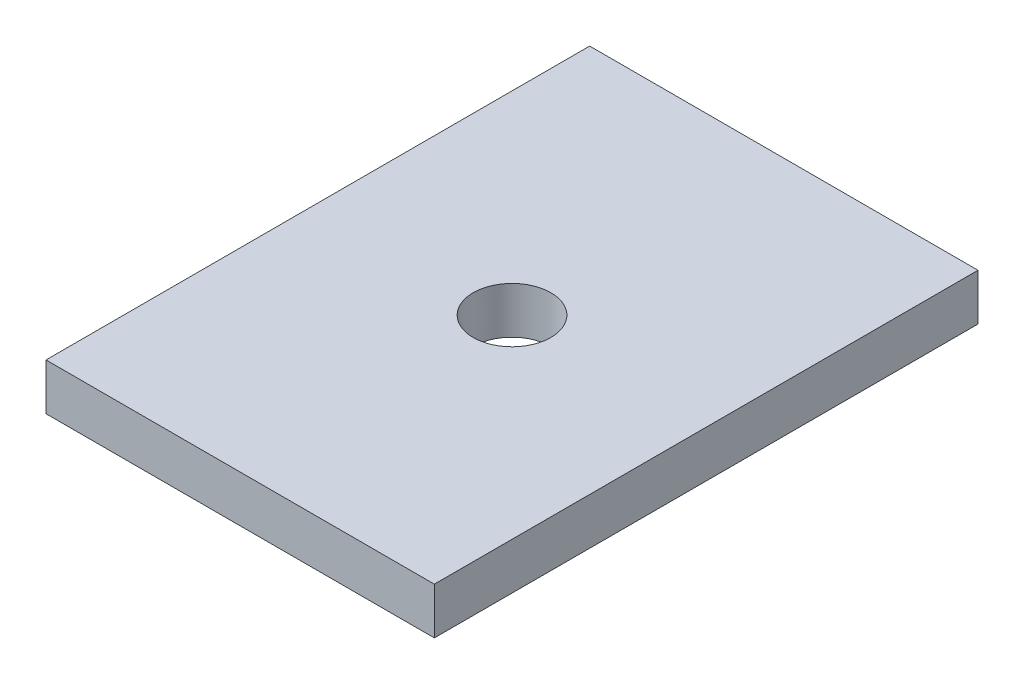
ISO-10303-21;
HEADER;
FILE_DESCRIPTION(('STEP AP214'),'2;1');
FILE_NAME('part.step','',(''),(''),'','','');
FILE_SCHEMA(('AUTOMOTIVE_DESIGN { 1 0 10303 214 1 1 1 1 }'));
ENDSEC;
DATA;
#1=APPLICATION_CONTEXT('core data for automotive mechanical design processes');
#2=APPLICATION_PROTOCOL_DEFINITION('international standard','automotive_design',2000,#1);
#3=PRODUCT_CONTEXT('',#1,'mechanical');
#4=PRODUCT('Part','Part','',(#3));
#5=PRODUCT_RELATED_PRODUCT_CATEGORY('part','',(#4));
#6=PRODUCT_DEFINITION_FORMATION('','',#4);
#7=PRODUCT_DEFINITION_CONTEXT('part definition',#1,'design');
#8=PRODUCT_DEFINITION('design','',#6,#7);
#9=PRODUCT_DEFINITION_SHAPE('','',#8);
#10=(LENGTH_UNIT() NAMED_UNIT(*) SI_UNIT(.MILLI.,.METRE.));
#11=(NAMED_UNIT(*) PLANE_ANGLE_UNIT() SI_UNIT($,.RADIAN.));
#12=(NAMED_UNIT(*) SI_UNIT($,.STERADIAN.) SOLID_ANGLE_UNIT());
#13=UNCERTAINTY_MEASURE_WITH_UNIT(LENGTH_MEASURE(1.E-05),#10,'distance_accuracy_value','');
#14=(GEOMETRIC_REPRESENTATION_CONTEXT(3) GLOBAL_UNCERTAINTY_ASSIGNED_CONTEXT((#13)) GLOBAL_UNIT_ASSIGNED_CONTEXT((#10,
#11,#12)) REPRESENTATION_CONTEXT('',''));
#15=CARTESIAN_POINT('',(0.,0.,0.));
#16=DIRECTION('',(0.,0.,1.));
#17=DIRECTION('',(1.,0.,0.));
#18=AXIS2_PLACEMENT_3D('',#15,#16,#17);
#19=CARTESIAN_POINT('',(0.,3.,0.));
#20=DIRECTION('',(0.,-1.,0.));
#21=DIRECTION('',(0.,0.,-1.));
#22=AXIS2_PLACEMENT_3D('',#19,#20,#21);
#23=PLANE('',#22);
#24=DIRECTION('',(0.,0.,1.));
#25=VECTOR('',#24,1.);
#26=CARTESIAN_POINT('',(0.,3.,0.));
#27=LINE('',#26,#25);
#28=CARTESIAN_POINT('',(0.,3.,-35.));
#29=VERTEX_POINT('',#28);
#30=CARTESIAN_POINT('',(0.,3.,0.));
#31=VERTEX_POINT('',#30);
#32=EDGE_CURVE('E85',#29,#31,#27,.T.);
#33=ORIENTED_EDGE('',*,*,#32,.T.);
#34=DIRECTION('',(1.,0.,0.));
#35=VECTOR('',#34,1.);
#36=CARTESIAN_POINT('',(0.,3.,0.));
#37=LINE('',#36,#35);
#38=CARTESIAN_POINT('',(25.,3.,0.));
#39=VERTEX_POINT('',#38);
#40=EDGE_CURVE('E80',#31,#39,#37,.T.);
#41=ORIENTED_EDGE('',*,*,#40,.T.);
#42=DIRECTION('',(0.,0.,-1.));
#43=VECTOR('',#42,1.);
#44=CARTESIAN_POINT('',(25.,3.,0.));
#45=LINE('',#44,#43);
#46=CARTESIAN_POINT('',(25.,3.,-35.));
#47=VERTEX_POINT('',#46);
#48=EDGE_CURVE('E83',#39,#47,#45,.T.);
#49=ORIENTED_EDGE('',*,*,#48,.T.);
#50=DIRECTION('',(-1.,0.,0.));
#51=VECTOR('',#50,1.);
#52=CARTESIAN_POINT('',(0.,3.,-35.));
#53=LINE('',#52,#51);
#54=EDGE_CURVE('E50',#47,#29,#53,.T.);
#55=ORIENTED_EDGE('',*,*,#54,.T.);
#56=EDGE_LOOP('',(#33,#41,#49,#55));
#57=FACE_BOUND('',#56,.T.);
#58=CARTESIAN_POINT('',(12.5,3.,-17.5));
#59=DIRECTION('',(0.,-1.,0.));
#60=DIRECTION('',(0.,0.,-1.));
#61=AXIS2_PLACEMENT_3D('',#58,#59,#60);
#62=CIRCLE('',#61,2.5);
#63=CARTESIAN_POINT('',(12.5,3.,-20.));
#64=VERTEX_POINT('',#63);
#65=EDGE_CURVE('E100',#64,#64,#62,.F.);
#66=ORIENTED_EDGE('',*,*,#65,.F.);
#67=EDGE_LOOP('',(#66));
#68=FACE_BOUND('',#67,.T.);
#69=ADVANCED_FACE('F33',(#57,#68),#23,.F.);
#70=CARTESIAN_POINT('',(0.,0.,0.));
#71=DIRECTION('',(0.,-1.,0.));
#72=DIRECTION('',(0.,0.,-1.));
#73=AXIS2_PLACEMENT_3D('',#70,#71,#72);
#74=PLANE('',#73);
#75=DIRECTION('',(0.,0.,1.));
#76=VECTOR('',#75,1.);
#77=CARTESIAN_POINT('',(0.,0.,0.));
#78=LINE('',#77,#76);
#79=CARTESIAN_POINT('',(0.,0.,-35.));
#80=VERTEX_POINT('',#79);
#81=CARTESIAN_POINT('',(0.,0.,0.));
#82=VERTEX_POINT('',#81);
#83=EDGE_CURVE('E97',#80,#82,#78,.T.);
#84=ORIENTED_EDGE('',*,*,#83,.F.);
#85=DIRECTION('',(-1.,0.,0.));
#86=VECTOR('',#85,1.);
#87=CARTESIAN_POINT('',(0.,0.,-35.));
#88=LINE('',#87,#86);
#89=CARTESIAN_POINT('',(25.,0.,-35.));
#90=VERTEX_POINT('',#89);
#91=EDGE_CURVE('E73',#90,#80,#88,.T.);
#92=ORIENTED_EDGE('',*,*,#91,.F.);
#93=DIRECTION('',(0.,0.,-1.));
#94=VECTOR('',#93,1.);
#95=CARTESIAN_POINT('',(25.,0.,0.));
#96=LINE('',#95,#94);
#97=CARTESIAN_POINT('',(25.,0.,0.));
#98=VERTEX_POINT('',#97);
#99=EDGE_CURVE('E67',#98,#90,#96,.T.);
#100=ORIENTED_EDGE('',*,*,#99,.F.);
#101=DIRECTION('',(1.,0.,0.));
#102=VECTOR('',#101,1.);
#103=CARTESIAN_POINT('',(0.,0.,0.));
#104=LINE('',#103,#102);
#105=EDGE_CURVE('E89',#82,#98,#104,.T.);
#106=ORIENTED_EDGE('',*,*,#105,.F.);
#107=EDGE_LOOP('',(#84,#92,#100,#106));
#108=FACE_BOUND('',#107,.T.);
#109=CARTESIAN_POINT('',(12.5,0.,-17.5));
#110=DIRECTION('',(0.,1.,0.));
#111=DIRECTION('',(0.,0.,1.));
#112=AXIS2_PLACEMENT_3D('',#109,#110,#111);
#113=CIRCLE('',#112,2.5);
#114=CARTESIAN_POINT('',(12.5,0.,-15.));
#115=VERTEX_POINT('',#114);
#116=EDGE_CURVE('E114',#115,#115,#113,.T.);
#117=ORIENTED_EDGE('',*,*,#116,.T.);
#118=EDGE_LOOP('',(#117));
#119=FACE_BOUND('',#118,.T.);
#120=ADVANCED_FACE('F108',(#108,#119),#74,.T.);
#121=CARTESIAN_POINT('',(0.,3.,0.));
#122=DIRECTION('',(1.,0.,0.));
#123=DIRECTION('',(0.,0.,-1.));
#124=AXIS2_PLACEMENT_3D('',#121,#122,#123);
#125=PLANE('',#124);
#126=ORIENTED_EDGE('',*,*,#83,.T.);
#127=DIRECTION('',(0.,-1.,0.));
#128=VECTOR('',#127,1.);
#129=CARTESIAN_POINT('',(0.,3.,0.));
#130=LINE('',#129,#128);
#131=EDGE_CURVE('E11',#31,#82,#130,.T.);
#132=ORIENTED_EDGE('',*,*,#131,.F.);
#133=ORIENTED_EDGE('',*,*,#32,.F.);
#134=DIRECTION('',(0.,-1.,0.));
#135=VECTOR('',#134,1.);
#136=CARTESIAN_POINT('',(0.,3.,-35.));
#137=LINE('',#136,#135);
#138=EDGE_CURVE('E93',#29,#80,#137,.T.);
#139=ORIENTED_EDGE('',*,*,#138,.T.);
#140=EDGE_LOOP('',(#126,#132,#133,#139));
#141=FACE_BOUND('',#140,.T.);
#142=ADVANCED_FACE('F35',(#141),#125,.F.);
#143=CARTESIAN_POINT('',(0.,3.,0.));
#144=DIRECTION('',(0.,0.,-1.));
#145=DIRECTION('',(-1.,0.,0.));
#146=AXIS2_PLACEMENT_3D('',#143,#144,#145);
#147=PLANE('',#146);
#148=ORIENTED_EDGE('',*,*,#105,.T.);
#149=DIRECTION('',(0.,-1.,0.));
#150=VECTOR('',#149,1.);
#151=CARTESIAN_POINT('',(25.,3.,0.));
#152=LINE('',#151,#150);
#153=EDGE_CURVE('E42',#39,#98,#152,.T.);
#154=ORIENTED_EDGE('',*,*,#153,.F.);
#155=ORIENTED_EDGE('',*,*,#40,.F.);
#156=ORIENTED_EDGE('',*,*,#131,.T.);
#157=EDGE_LOOP('',(#148,#154,#155,#156));
#158=FACE_BOUND('',#157,.T.);
#159=ADVANCED_FACE('F88',(#158),#147,.F.);
#160=CARTESIAN_POINT('',(25.,3.,0.));
#161=DIRECTION('',(-1.,0.,0.));
#162=DIRECTION('',(0.,0.,1.));
#163=AXIS2_PLACEMENT_3D('',#160,#161,#162);
#164=PLANE('',#163);
#165=ORIENTED_EDGE('',*,*,#99,.T.);
#166=DIRECTION('',(0.,-1.,0.));
#167=VECTOR('',#166,1.);
#168=CARTESIAN_POINT('',(25.,3.,-35.));
#169=LINE('',#168,#167);
#170=EDGE_CURVE('E90',#47,#90,#169,.T.);
#171=ORIENTED_EDGE('',*,*,#170,.F.);
#172=ORIENTED_EDGE('',*,*,#48,.F.);
#173=ORIENTED_EDGE('',*,*,#153,.T.);
#174=EDGE_LOOP('',(#165,#171,#172,#173));
#175=FACE_BOUND('',#174,.T.);
#176=ADVANCED_FACE('F91',(#175),#164,.F.);
#177=CARTESIAN_POINT('',(0.,3.,-35.));
#178=DIRECTION('',(0.,0.,1.));
#179=DIRECTION('',(1.,0.,0.));
#180=AXIS2_PLACEMENT_3D('',#177,#178,#179);
#181=PLANE('',#180);
#182=ORIENTED_EDGE('',*,*,#91,.T.);
#183=ORIENTED_EDGE('',*,*,#138,.F.);
#184=ORIENTED_EDGE('',*,*,#54,.F.);
#185=ORIENTED_EDGE('',*,*,#170,.T.);
#186=EDGE_LOOP('',(#182,#183,#184,#185));
#187=FACE_BOUND('',#186,.T.);
#188=ADVANCED_FACE('F105',(#187),#181,.F.);
#189=CARTESIAN_POINT('',(12.5,12.,-17.5));
#190=DIRECTION('',(0.,-1.,0.));
#191=DIRECTION('',(0.,0.,-1.));
#192=AXIS2_PLACEMENT_3D('',#189,#190,#191);
#193=CYLINDRICAL_SURFACE('',#192,2.5);
#194=ORIENTED_EDGE('',*,*,#116,.F.);
#195=EDGE_LOOP('',(#194));
#196=FACE_BOUND('',#195,.T.);
#197=ORIENTED_EDGE('',*,*,#65,.T.);
#198=EDGE_LOOP('',(#197));
#199=FACE_BOUND('',#198,.T.);
#200=ADVANCED_FACE('F118',(#196,#199),#193,.F.);
#201=CLOSED_SHELL('',(#69,#120,#142,#159,#176,#188,#200));
#202=MANIFOLD_SOLID_BREP('B2',#201);
#203=ADVANCED_BREP_SHAPE_REPRESENTATION('',(#18,#202),#14);
#204=SHAPE_DEFINITION_REPRESENTATION(#9,#203);
ENDSEC;
END-ISO-10303-21;
